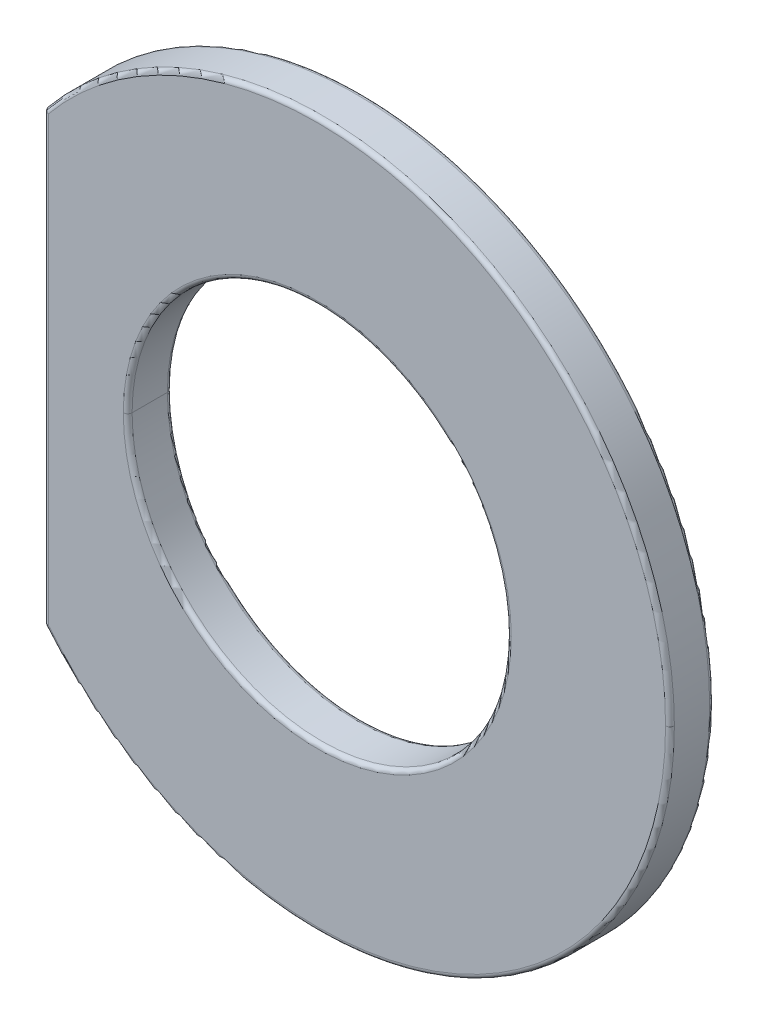
ISO-10303-21;
HEADER;
FILE_DESCRIPTION(('STEP AP214'),'2;1');
FILE_NAME('part.step','',(''),(''),'','','');
FILE_SCHEMA(('AUTOMOTIVE_DESIGN { 1 0 10303 214 1 1 1 1 }'));
ENDSEC;
DATA;
#1=APPLICATION_CONTEXT('core data for automotive mechanical design processes');
#2=APPLICATION_PROTOCOL_DEFINITION('international standard','automotive_design',2000,#1);
#3=PRODUCT_CONTEXT('',#1,'mechanical');
#4=PRODUCT('Part','Part','',(#3));
#5=PRODUCT_RELATED_PRODUCT_CATEGORY('part','',(#4));
#6=PRODUCT_DEFINITION_FORMATION('','',#4);
#7=PRODUCT_DEFINITION_CONTEXT('part definition',#1,'design');
#8=PRODUCT_DEFINITION('design','',#6,#7);
#9=PRODUCT_DEFINITION_SHAPE('','',#8);
#10=(LENGTH_UNIT() NAMED_UNIT(*) SI_UNIT(.MILLI.,.METRE.));
#11=(NAMED_UNIT(*) PLANE_ANGLE_UNIT() SI_UNIT($,.RADIAN.));
#12=(NAMED_UNIT(*) SI_UNIT($,.STERADIAN.) SOLID_ANGLE_UNIT());
#13=UNCERTAINTY_MEASURE_WITH_UNIT(LENGTH_MEASURE(1.E-05),#10,'distance_accuracy_value','');
#14=(GEOMETRIC_REPRESENTATION_CONTEXT(3) GLOBAL_UNCERTAINTY_ASSIGNED_CONTEXT((#13)) GLOBAL_UNIT_ASSIGNED_CONTEXT((#10,
#11,#12)) REPRESENTATION_CONTEXT('',''));
#15=CARTESIAN_POINT('',(0.,0.,0.));
#16=DIRECTION('',(0.,0.,1.));
#17=DIRECTION('',(1.,0.,0.));
#18=AXIS2_PLACEMENT_3D('',#15,#16,#17);
#19=CARTESIAN_POINT('',(0.,0.,-0.2));
#20=DIRECTION('',(0.,0.,1.));
#21=DIRECTION('',(1.,0.,0.));
#22=AXIS2_PLACEMENT_3D('',#19,#20,#21);
#23=TOROIDAL_SURFACE('',#22,3.95,0.05);
#24=CARTESIAN_POINT('',(3.95,0.,-0.2));
#25=DIRECTION('',(0.,-1.,0.));
#26=DIRECTION('',(0.,0.,-1.));
#27=AXIS2_PLACEMENT_3D('',#24,#25,#26);
#28=CIRCLE('',#27,0.05);
#29=CARTESIAN_POINT('',(3.95,0.,-0.25));
#30=VERTEX_POINT('',#29);
#31=CARTESIAN_POINT('',(4.,0.,-0.2));
#32=VERTEX_POINT('',#31);
#33=EDGE_CURVE('E151',#30,#32,#28,.T.);
#34=ORIENTED_EDGE('',*,*,#33,.F.);
#35=CARTESIAN_POINT('',(0.,0.,-0.25));
#36=DIRECTION('',(0.,0.,-1.));
#37=DIRECTION('',(1.,0.,0.));
#38=AXIS2_PLACEMENT_3D('',#35,#36,#37);
#39=CIRCLE('',#38,3.95);
#40=CARTESIAN_POINT('',(-3.05,2.50998007960223,-0.25));
#41=VERTEX_POINT('',#40);
#42=EDGE_CURVE('E139',#41,#30,#39,.T.);
#43=ORIENTED_EDGE('',*,*,#42,.F.);
#44=CARTESIAN_POINT('',(-3.05,2.50998007960223,-0.2));
#45=DIRECTION('',(0.635437994836009,0.772151898734175,0.));
#46=DIRECTION('',(0.772151898734175,-0.635437994836009,0.));
#47=AXIS2_PLACEMENT_3D('',#44,#45,#46);
#48=CIRCLE('',#47,0.05);
#49=CARTESIAN_POINT('',(-3.08860759493671,2.54175197934403,-0.2));
#50=VERTEX_POINT('',#49);
#51=EDGE_CURVE('E10',#41,#50,#48,.T.);
#52=ORIENTED_EDGE('',*,*,#51,.T.);
#53=CARTESIAN_POINT('',(0.,0.,-0.2));
#54=DIRECTION('',(0.,0.,1.));
#55=DIRECTION('',(1.,0.,0.));
#56=AXIS2_PLACEMENT_3D('',#53,#54,#55);
#57=CIRCLE('',#56,4.);
#58=EDGE_CURVE('E153',#32,#50,#57,.T.);
#59=ORIENTED_EDGE('',*,*,#58,.F.);
#60=EDGE_LOOP('',(#34,#43,#52,#59));
#61=FACE_BOUND('',#60,.T.);
#62=ADVANCED_FACE('F15',(#61),#23,.T.);
#63=CARTESIAN_POINT('',(-3.05,2.50998007960223,-0.2));
#64=DIRECTION('',(0.,1.,0.));
#65=DIRECTION('',(1.,0.,0.));
#66=AXIS2_PLACEMENT_3D('',#63,#64,#65);
#67=SPHERICAL_SURFACE('',#66,0.05);
#68=CARTESIAN_POINT('',(-3.05,2.50998007960223,-0.2));
#69=DIRECTION('',(0.,1.,0.));
#70=DIRECTION('',(-1.,0.,0.));
#71=AXIS2_PLACEMENT_3D('',#68,#69,#70);
#72=CIRCLE('',#71,0.05);
#73=CARTESIAN_POINT('',(-3.1,2.50998007960223,-0.2));
#74=VERTEX_POINT('',#73);
#75=EDGE_CURVE('E18',#41,#74,#72,.T.);
#76=ORIENTED_EDGE('',*,*,#75,.T.);
#77=CARTESIAN_POINT('',(-3.05,2.50998007960223,-0.2));
#78=DIRECTION('',(0.,0.,-1.));
#79=DIRECTION('',(-1.,0.,0.));
#80=AXIS2_PLACEMENT_3D('',#77,#78,#79);
#81=CIRCLE('',#80,0.05);
#82=EDGE_CURVE('E296',#74,#50,#81,.T.);
#83=ORIENTED_EDGE('',*,*,#82,.T.);
#84=ORIENTED_EDGE('',*,*,#51,.F.);
#85=EDGE_LOOP('',(#76,#83,#84));
#86=FACE_BOUND('',#85,.T.);
#87=ADVANCED_FACE('F311',(#86),#67,.T.);
#88=CARTESIAN_POINT('',(-3.05,-2.50998007960223,-0.2));
#89=DIRECTION('',(0.,1.,0.));
#90=DIRECTION('',(1.,0.,0.));
#91=AXIS2_PLACEMENT_3D('',#88,#89,#90);
#92=SPHERICAL_SURFACE('',#91,0.05);
#93=CARTESIAN_POINT('',(-3.05,-2.50998007960223,-0.2));
#94=DIRECTION('',(0.,0.,-1.));
#95=DIRECTION('',(-1.,0.,0.));
#96=AXIS2_PLACEMENT_3D('',#93,#94,#95);
#97=CIRCLE('',#96,0.05);
#98=CARTESIAN_POINT('',(-3.08860759493671,-2.54175197934403,-0.2));
#99=VERTEX_POINT('',#98);
#100=CARTESIAN_POINT('',(-3.1,-2.50998007960223,-0.2));
#101=VERTEX_POINT('',#100);
#102=EDGE_CURVE('E292',#99,#101,#97,.T.);
#103=ORIENTED_EDGE('',*,*,#102,.T.);
#104=CARTESIAN_POINT('',(-3.05,-2.50998007960223,-0.2));
#105=DIRECTION('',(0.,-1.,0.));
#106=DIRECTION('',(0.,0.,-1.));
#107=AXIS2_PLACEMENT_3D('',#104,#105,#106);
#108=CIRCLE('',#107,0.05);
#109=CARTESIAN_POINT('',(-3.05,-2.50998007960223,-0.25));
#110=VERTEX_POINT('',#109);
#111=EDGE_CURVE('E299',#101,#110,#108,.T.);
#112=ORIENTED_EDGE('',*,*,#111,.T.);
#113=CARTESIAN_POINT('',(-3.05,-2.50998007960223,-0.2));
#114=DIRECTION('',(0.635437994836009,-0.772151898734175,0.));
#115=DIRECTION('',(-0.772151898734175,-0.635437994836009,0.));
#116=AXIS2_PLACEMENT_3D('',#113,#114,#115);
#117=CIRCLE('',#116,0.05);
#118=EDGE_CURVE('E163',#99,#110,#117,.T.);
#119=ORIENTED_EDGE('',*,*,#118,.F.);
#120=EDGE_LOOP('',(#103,#112,#119));
#121=FACE_BOUND('',#120,.T.);
#122=ADVANCED_FACE('F322',(#121),#92,.T.);
#123=CARTESIAN_POINT('',(-3.05,2.52784493195291,-0.2));
#124=DIRECTION('',(0.,-1.,0.));
#125=DIRECTION('',(0.,0.,-1.));
#126=AXIS2_PLACEMENT_3D('',#123,#124,#125);
#127=CYLINDRICAL_SURFACE('',#126,0.05);
#128=ORIENTED_EDGE('',*,*,#111,.F.);
#129=DIRECTION('',(0.,-1.,0.));
#130=VECTOR('',#129,1.);
#131=CARTESIAN_POINT('',(-3.1,2.52784493195291,-0.2));
#132=LINE('',#131,#130);
#133=EDGE_CURVE('E259',#74,#101,#132,.T.);
#134=ORIENTED_EDGE('',*,*,#133,.F.);
#135=ORIENTED_EDGE('',*,*,#75,.F.);
#136=DIRECTION('',(0.,1.,0.));
#137=VECTOR('',#136,1.);
#138=CARTESIAN_POINT('',(-3.05,0.,-0.25));
#139=LINE('',#138,#137);
#140=EDGE_CURVE('E145',#110,#41,#139,.T.);
#141=ORIENTED_EDGE('',*,*,#140,.F.);
#142=EDGE_LOOP('',(#128,#134,#135,#141));
#143=FACE_BOUND('',#142,.T.);
#144=ADVANCED_FACE('F321',(#143),#127,.T.);
#145=CARTESIAN_POINT('',(-3.05,2.50998007960223,0.25));
#146=DIRECTION('',(0.,0.,-1.));
#147=DIRECTION('',(-1.,0.,0.));
#148=AXIS2_PLACEMENT_3D('',#145,#146,#147);
#149=CYLINDRICAL_SURFACE('',#148,0.05);
#150=CARTESIAN_POINT('',(-3.05,2.50998007960223,0.2));
#151=DIRECTION('',(0.,0.,-1.));
#152=DIRECTION('',(1.,0.,0.));
#153=AXIS2_PLACEMENT_3D('',#150,#151,#152);
#154=CIRCLE('',#153,0.05);
#155=CARTESIAN_POINT('',(-3.1,2.50998007960223,0.2));
#156=VERTEX_POINT('',#155);
#157=CARTESIAN_POINT('',(-3.08860759493671,2.54175197934403,0.2));
#158=VERTEX_POINT('',#157);
#159=EDGE_CURVE('E37',#156,#158,#154,.T.);
#160=ORIENTED_EDGE('',*,*,#159,.T.);
#161=DIRECTION('',(0.,0.,1.));
#162=VECTOR('',#161,1.);
#163=CARTESIAN_POINT('',(-3.08860759493671,2.54175197934403,0.25));
#164=LINE('',#163,#162);
#165=EDGE_CURVE('E253',#50,#158,#164,.T.);
#166=ORIENTED_EDGE('',*,*,#165,.F.);
#167=ORIENTED_EDGE('',*,*,#82,.F.);
#168=DIRECTION('',(0.,0.,-1.));
#169=VECTOR('',#168,1.);
#170=CARTESIAN_POINT('',(-3.1,2.50998007960223,0.25));
#171=LINE('',#170,#169);
#172=EDGE_CURVE('E270',#156,#74,#171,.T.);
#173=ORIENTED_EDGE('',*,*,#172,.F.);
#174=EDGE_LOOP('',(#160,#166,#167,#173));
#175=FACE_BOUND('',#174,.T.);
#176=ADVANCED_FACE('F317',(#175),#149,.T.);
#177=CARTESIAN_POINT('',(-3.05,-2.50998007960223,0.25));
#178=DIRECTION('',(0.,0.,-1.));
#179=DIRECTION('',(-1.,0.,0.));
#180=AXIS2_PLACEMENT_3D('',#177,#178,#179);
#181=CYLINDRICAL_SURFACE('',#180,0.05);
#182=CARTESIAN_POINT('',(-3.05,-2.50998007960223,0.2));
#183=DIRECTION('',(0.,0.,-1.));
#184=DIRECTION('',(1.,0.,0.));
#185=AXIS2_PLACEMENT_3D('',#182,#183,#184);
#186=CIRCLE('',#185,0.05);
#187=CARTESIAN_POINT('',(-3.08860759493671,-2.54175197934403,0.2));
#188=VERTEX_POINT('',#187);
#189=CARTESIAN_POINT('',(-3.1,-2.50998007960223,0.2));
#190=VERTEX_POINT('',#189);
#191=EDGE_CURVE('E48',#188,#190,#186,.T.);
#192=ORIENTED_EDGE('',*,*,#191,.T.);
#193=DIRECTION('',(0.,0.,1.));
#194=VECTOR('',#193,1.);
#195=CARTESIAN_POINT('',(-3.1,-2.50998007960223,0.25));
#196=LINE('',#195,#194);
#197=EDGE_CURVE('E271',#101,#190,#196,.T.);
#198=ORIENTED_EDGE('',*,*,#197,.F.);
#199=ORIENTED_EDGE('',*,*,#102,.F.);
#200=DIRECTION('',(0.,0.,-1.));
#201=VECTOR('',#200,1.);
#202=CARTESIAN_POINT('',(-3.08860759493671,-2.54175197934403,0.25));
#203=LINE('',#202,#201);
#204=EDGE_CURVE('E254',#188,#99,#203,.T.);
#205=ORIENTED_EDGE('',*,*,#204,.F.);
#206=EDGE_LOOP('',(#192,#198,#199,#205));
#207=FACE_BOUND('',#206,.T.);
#208=ADVANCED_FACE('F323',(#207),#181,.T.);
#209=CARTESIAN_POINT('',(-3.05,2.50998007960223,0.2));
#210=DIRECTION('',(0.,1.,0.));
#211=DIRECTION('',(1.,0.,0.));
#212=AXIS2_PLACEMENT_3D('',#209,#210,#211);
#213=SPHERICAL_SURFACE('',#212,0.05);
#214=CARTESIAN_POINT('',(-3.05,2.50998007960223,0.2));
#215=DIRECTION('',(0.,1.,0.));
#216=DIRECTION('',(0.,0.,1.));
#217=AXIS2_PLACEMENT_3D('',#214,#215,#216);
#218=CIRCLE('',#217,0.05);
#219=CARTESIAN_POINT('',(-3.05,2.50998007960223,0.25));
#220=VERTEX_POINT('',#219);
#221=EDGE_CURVE('E201',#156,#220,#218,.T.);
#222=ORIENTED_EDGE('',*,*,#221,.T.);
#223=CARTESIAN_POINT('',(-3.05,2.50998007960223,0.2));
#224=DIRECTION('',(-0.635437994836004,-0.77215189873418,0.));
#225=DIRECTION('',(0.77215189873418,-0.635437994836004,0.));
#226=AXIS2_PLACEMENT_3D('',#223,#224,#225);
#227=CIRCLE('',#226,0.05);
#228=EDGE_CURVE('E202',#220,#158,#227,.T.);
#229=ORIENTED_EDGE('',*,*,#228,.T.);
#230=ORIENTED_EDGE('',*,*,#159,.F.);
#231=EDGE_LOOP('',(#222,#229,#230));
#232=FACE_BOUND('',#231,.T.);
#233=ADVANCED_FACE('F325',(#232),#213,.T.);
#234=CARTESIAN_POINT('',(-3.05,-2.50998007960223,0.2));
#235=DIRECTION('',(0.,1.,0.));
#236=DIRECTION('',(1.,0.,0.));
#237=AXIS2_PLACEMENT_3D('',#234,#235,#236);
#238=SPHERICAL_SURFACE('',#237,0.05);
#239=CARTESIAN_POINT('',(-3.05,-2.50998007960223,0.2));
#240=DIRECTION('',(-0.635437994836009,0.772151898734175,0.));
#241=DIRECTION('',(-0.772151898734175,-0.635437994836009,0.));
#242=AXIS2_PLACEMENT_3D('',#239,#240,#241);
#243=CIRCLE('',#242,0.05);
#244=CARTESIAN_POINT('',(-3.05,-2.50998007960223,0.25));
#245=VERTEX_POINT('',#244);
#246=EDGE_CURVE('E197',#188,#245,#243,.T.);
#247=ORIENTED_EDGE('',*,*,#246,.T.);
#248=CARTESIAN_POINT('',(-3.05,-2.50998007960223,0.2));
#249=DIRECTION('',(0.,-1.,0.));
#250=DIRECTION('',(0.,0.,-1.));
#251=AXIS2_PLACEMENT_3D('',#248,#249,#250);
#252=CIRCLE('',#251,0.05);
#253=EDGE_CURVE('E198',#245,#190,#252,.T.);
#254=ORIENTED_EDGE('',*,*,#253,.T.);
#255=ORIENTED_EDGE('',*,*,#191,.F.);
#256=EDGE_LOOP('',(#247,#254,#255));
#257=FACE_BOUND('',#256,.T.);
#258=ADVANCED_FACE('F332',(#257),#238,.T.);
#259=CARTESIAN_POINT('',(-3.05,0.,0.2));
#260=DIRECTION('',(0.,1.,0.));
#261=DIRECTION('',(0.,0.,1.));
#262=AXIS2_PLACEMENT_3D('',#259,#260,#261);
#263=CYLINDRICAL_SURFACE('',#262,0.05);
#264=ORIENTED_EDGE('',*,*,#253,.F.);
#265=DIRECTION('',(0.,-1.,0.));
#266=VECTOR('',#265,1.);
#267=CARTESIAN_POINT('',(-3.05,-2.52784493195291,0.25));
#268=LINE('',#267,#266);
#269=EDGE_CURVE('E247',#220,#245,#268,.T.);
#270=ORIENTED_EDGE('',*,*,#269,.F.);
#271=ORIENTED_EDGE('',*,*,#221,.F.);
#272=DIRECTION('',(0.,1.,0.));
#273=VECTOR('',#272,1.);
#274=CARTESIAN_POINT('',(-3.1,2.52784493195291,0.2));
#275=LINE('',#274,#273);
#276=EDGE_CURVE('E266',#190,#156,#275,.T.);
#277=ORIENTED_EDGE('',*,*,#276,.F.);
#278=EDGE_LOOP('',(#264,#270,#271,#277));
#279=FACE_BOUND('',#278,.T.);
#280=ADVANCED_FACE('F381',(#279),#263,.T.);
#281=CARTESIAN_POINT('',(0.,0.,0.2));
#282=DIRECTION('',(0.,0.,1.));
#283=DIRECTION('',(1.,0.,0.));
#284=AXIS2_PLACEMENT_3D('',#281,#282,#283);
#285=TOROIDAL_SURFACE('',#284,3.95,0.05);
#286=CARTESIAN_POINT('',(3.95,0.,0.2));
#287=DIRECTION('',(0.,-1.,0.));
#288=DIRECTION('',(0.,0.,-1.));
#289=AXIS2_PLACEMENT_3D('',#286,#287,#288);
#290=CIRCLE('',#289,0.05);
#291=CARTESIAN_POINT('',(4.,0.,0.2));
#292=VERTEX_POINT('',#291);
#293=CARTESIAN_POINT('',(3.95,0.,0.25));
#294=VERTEX_POINT('',#293);
#295=EDGE_CURVE('E175',#292,#294,#290,.T.);
#296=ORIENTED_EDGE('',*,*,#295,.F.);
#297=CARTESIAN_POINT('',(0.,0.,0.2));
#298=DIRECTION('',(0.,0.,-1.));
#299=DIRECTION('',(1.,0.,0.));
#300=AXIS2_PLACEMENT_3D('',#297,#298,#299);
#301=CIRCLE('',#300,4.);
#302=EDGE_CURVE('E257',#158,#292,#301,.T.);
#303=ORIENTED_EDGE('',*,*,#302,.F.);
#304=ORIENTED_EDGE('',*,*,#228,.F.);
#305=CARTESIAN_POINT('',(0.,0.,0.25));
#306=DIRECTION('',(0.,0.,1.));
#307=DIRECTION('',(1.,0.,0.));
#308=AXIS2_PLACEMENT_3D('',#305,#306,#307);
#309=CIRCLE('',#308,3.95);
#310=EDGE_CURVE('E243',#294,#220,#309,.T.);
#311=ORIENTED_EDGE('',*,*,#310,.F.);
#312=EDGE_LOOP('',(#296,#303,#304,#311));
#313=FACE_BOUND('',#312,.T.);
#314=ADVANCED_FACE('F391',(#313),#285,.T.);
#315=CARTESIAN_POINT('',(0.,0.,0.2));
#316=DIRECTION('',(0.,0.,1.));
#317=DIRECTION('',(1.,0.,0.));
#318=AXIS2_PLACEMENT_3D('',#315,#316,#317);
#319=TOROIDAL_SURFACE('',#318,2.2,0.05);
#320=CARTESIAN_POINT('',(-2.2,0.,0.2));
#321=DIRECTION('',(0.,1.,0.));
#322=DIRECTION('',(-1.,0.,0.));
#323=AXIS2_PLACEMENT_3D('',#320,#321,#322);
#324=CIRCLE('',#323,0.05);
#325=CARTESIAN_POINT('',(-2.2,0.,0.25));
#326=VERTEX_POINT('',#325);
#327=CARTESIAN_POINT('',(-2.15,0.,0.2));
#328=VERTEX_POINT('',#327);
#329=EDGE_CURVE('E183',#326,#328,#324,.T.);
#330=ORIENTED_EDGE('',*,*,#329,.F.);
#331=CARTESIAN_POINT('',(0.,0.,0.25));
#332=DIRECTION('',(0.,0.,-1.));
#333=DIRECTION('',(1.,0.,0.));
#334=AXIS2_PLACEMENT_3D('',#331,#332,#333);
#335=CIRCLE('',#334,2.2);
#336=CARTESIAN_POINT('',(2.2,0.,0.25));
#337=VERTEX_POINT('',#336);
#338=EDGE_CURVE('E174',#337,#326,#335,.T.);
#339=ORIENTED_EDGE('',*,*,#338,.F.);
#340=CARTESIAN_POINT('',(2.2,0.,0.2));
#341=DIRECTION('',(0.,-1.,0.));
#342=DIRECTION('',(0.,0.,-1.));
#343=AXIS2_PLACEMENT_3D('',#340,#341,#342);
#344=CIRCLE('',#343,0.05);
#345=CARTESIAN_POINT('',(2.15,0.,0.2));
#346=VERTEX_POINT('',#345);
#347=EDGE_CURVE('E206',#337,#346,#344,.T.);
#348=ORIENTED_EDGE('',*,*,#347,.T.);
#349=CARTESIAN_POINT('',(0.,0.,0.2));
#350=DIRECTION('',(0.,0.,1.));
#351=DIRECTION('',(1.,0.,0.));
#352=AXIS2_PLACEMENT_3D('',#349,#350,#351);
#353=CIRCLE('',#352,2.15);
#354=EDGE_CURVE('E232',#328,#346,#353,.T.);
#355=ORIENTED_EDGE('',*,*,#354,.F.);
#356=EDGE_LOOP('',(#330,#339,#348,#355));
#357=FACE_BOUND('',#356,.T.);
#358=ADVANCED_FACE('F402',(#357),#319,.T.);
#359=CARTESIAN_POINT('',(0.,0.,-0.2));
#360=DIRECTION('',(0.,0.,1.));
#361=DIRECTION('',(1.,0.,0.));
#362=AXIS2_PLACEMENT_3D('',#359,#360,#361);
#363=TOROIDAL_SURFACE('',#362,2.2,0.05);
#364=CARTESIAN_POINT('',(-2.2,0.,-0.2));
#365=DIRECTION('',(0.,1.,0.));
#366=DIRECTION('',(-1.,0.,0.));
#367=AXIS2_PLACEMENT_3D('',#364,#365,#366);
#368=CIRCLE('',#367,0.05);
#369=CARTESIAN_POINT('',(-2.15,0.,-0.2));
#370=VERTEX_POINT('',#369);
#371=CARTESIAN_POINT('',(-2.2,0.,-0.25));
#372=VERTEX_POINT('',#371);
#373=EDGE_CURVE('E220',#370,#372,#368,.T.);
#374=ORIENTED_EDGE('',*,*,#373,.F.);
#375=CARTESIAN_POINT('',(0.,0.,-0.2));
#376=DIRECTION('',(0.,0.,-1.));
#377=DIRECTION('',(1.,0.,0.));
#378=AXIS2_PLACEMENT_3D('',#375,#376,#377);
#379=CIRCLE('',#378,2.15);
#380=CARTESIAN_POINT('',(2.15,0.,-0.2));
#381=VERTEX_POINT('',#380);
#382=EDGE_CURVE('E172',#381,#370,#379,.T.);
#383=ORIENTED_EDGE('',*,*,#382,.F.);
#384=CARTESIAN_POINT('',(2.2,0.,-0.2));
#385=DIRECTION('',(0.,-1.,0.));
#386=DIRECTION('',(0.,0.,-1.));
#387=AXIS2_PLACEMENT_3D('',#384,#385,#386);
#388=CIRCLE('',#387,0.05);
#389=CARTESIAN_POINT('',(2.2,0.,-0.25));
#390=VERTEX_POINT('',#389);
#391=EDGE_CURVE('E228',#381,#390,#388,.T.);
#392=ORIENTED_EDGE('',*,*,#391,.T.);
#393=CARTESIAN_POINT('',(0.,0.,-0.25));
#394=DIRECTION('',(0.,0.,1.));
#395=DIRECTION('',(1.,0.,0.));
#396=AXIS2_PLACEMENT_3D('',#393,#394,#395);
#397=CIRCLE('',#396,2.2);
#398=EDGE_CURVE('E148',#372,#390,#397,.T.);
#399=ORIENTED_EDGE('',*,*,#398,.F.);
#400=EDGE_LOOP('',(#374,#383,#392,#399));
#401=FACE_BOUND('',#400,.T.);
#402=ADVANCED_FACE('F413',(#401),#363,.T.);
#403=CARTESIAN_POINT('',(0.,0.,0.25));
#404=DIRECTION('',(0.,0.,-1.));
#405=DIRECTION('',(-1.,0.,0.));
#406=AXIS2_PLACEMENT_3D('',#403,#404,#405);
#407=CYLINDRICAL_SURFACE('',#406,2.15);
#408=DIRECTION('',(0.,0.,-1.));
#409=VECTOR('',#408,1.);
#410=CARTESIAN_POINT('',(2.15,0.,0.25));
#411=LINE('',#410,#409);
#412=EDGE_CURVE('E236',#346,#381,#411,.T.);
#413=ORIENTED_EDGE('',*,*,#412,.F.);
#414=CARTESIAN_POINT('',(0.,0.,0.2));
#415=DIRECTION('',(0.,0.,1.));
#416=DIRECTION('',(1.,0.,0.));
#417=AXIS2_PLACEMENT_3D('',#414,#415,#416);
#418=CIRCLE('',#417,2.15);
#419=EDGE_CURVE('E187',#346,#328,#418,.T.);
#420=ORIENTED_EDGE('',*,*,#419,.T.);
#421=DIRECTION('',(0.,0.,-1.));
#422=VECTOR('',#421,1.);
#423=CARTESIAN_POINT('',(-2.15,0.,0.25));
#424=LINE('',#423,#422);
#425=EDGE_CURVE('E240',#328,#370,#424,.T.);
#426=ORIENTED_EDGE('',*,*,#425,.T.);
#427=CARTESIAN_POINT('',(0.,0.,-0.2));
#428=DIRECTION('',(0.,0.,-1.));
#429=DIRECTION('',(1.,0.,0.));
#430=AXIS2_PLACEMENT_3D('',#427,#428,#429);
#431=CIRCLE('',#430,2.15);
#432=EDGE_CURVE('E210',#370,#381,#431,.T.);
#433=ORIENTED_EDGE('',*,*,#432,.T.);
#434=EDGE_LOOP('',(#413,#420,#426,#433));
#435=FACE_BOUND('',#434,.T.);
#436=ADVANCED_FACE('F424',(#435),#407,.F.);
#437=CARTESIAN_POINT('',(-3.1,2.52784493195291,0.25));
#438=DIRECTION('',(1.,0.,0.));
#439=DIRECTION('',(0.,1.,0.));
#440=AXIS2_PLACEMENT_3D('',#437,#438,#439);
#441=PLANE('',#440);
#442=ORIENTED_EDGE('',*,*,#133,.T.);
#443=ORIENTED_EDGE('',*,*,#197,.T.);
#444=ORIENTED_EDGE('',*,*,#276,.T.);
#445=ORIENTED_EDGE('',*,*,#172,.T.);
#446=EDGE_LOOP('',(#442,#443,#444,#445));
#447=FACE_BOUND('',#446,.T.);
#448=ADVANCED_FACE('F319',(#447),#441,.F.);
#449=CARTESIAN_POINT('',(0.,0.,0.25));
#450=DIRECTION('',(0.,0.,-1.));
#451=DIRECTION('',(-1.,0.,0.));
#452=AXIS2_PLACEMENT_3D('',#449,#450,#451);
#453=CYLINDRICAL_SURFACE('',#452,4.);
#454=ORIENTED_EDGE('',*,*,#204,.T.);
#455=CARTESIAN_POINT('',(0.,0.,-0.2));
#456=DIRECTION('',(0.,0.,1.));
#457=DIRECTION('',(1.,0.,0.));
#458=AXIS2_PLACEMENT_3D('',#455,#456,#457);
#459=CIRCLE('',#458,4.);
#460=EDGE_CURVE('E158',#99,#32,#459,.T.);
#461=ORIENTED_EDGE('',*,*,#460,.T.);
#462=ORIENTED_EDGE('',*,*,#58,.T.);
#463=ORIENTED_EDGE('',*,*,#165,.T.);
#464=ORIENTED_EDGE('',*,*,#302,.T.);
#465=CARTESIAN_POINT('',(0.,0.,0.2));
#466=DIRECTION('',(0.,0.,-1.));
#467=DIRECTION('',(1.,0.,0.));
#468=AXIS2_PLACEMENT_3D('',#465,#466,#467);
#469=CIRCLE('',#468,4.);
#470=EDGE_CURVE('E179',#292,#188,#469,.T.);
#471=ORIENTED_EDGE('',*,*,#470,.T.);
#472=EDGE_LOOP('',(#454,#461,#462,#463,#464,#471));
#473=FACE_BOUND('',#472,.T.);
#474=ADVANCED_FACE('F445',(#473),#453,.T.);
#475=CARTESIAN_POINT('',(0.,0.,-0.25));
#476=DIRECTION('',(0.,0.,1.));
#477=DIRECTION('',(1.,0.,0.));
#478=AXIS2_PLACEMENT_3D('',#475,#476,#477);
#479=PLANE('',#478);
#480=CARTESIAN_POINT('',(0.,0.,-0.25));
#481=DIRECTION('',(0.,0.,1.));
#482=DIRECTION('',(1.,0.,0.));
#483=AXIS2_PLACEMENT_3D('',#480,#481,#482);
#484=CIRCLE('',#483,2.2);
#485=EDGE_CURVE('E224',#390,#372,#484,.T.);
#486=ORIENTED_EDGE('',*,*,#485,.T.);
#487=ORIENTED_EDGE('',*,*,#398,.T.);
#488=EDGE_LOOP('',(#486,#487));
#489=FACE_BOUND('',#488,.T.);
#490=ORIENTED_EDGE('',*,*,#140,.T.);
#491=ORIENTED_EDGE('',*,*,#42,.T.);
#492=CARTESIAN_POINT('',(0.,0.,-0.25));
#493=DIRECTION('',(0.,0.,-1.));
#494=DIRECTION('',(1.,0.,0.));
#495=AXIS2_PLACEMENT_3D('',#492,#493,#494);
#496=CIRCLE('',#495,3.95);
#497=EDGE_CURVE('E143',#30,#110,#496,.T.);
#498=ORIENTED_EDGE('',*,*,#497,.T.);
#499=EDGE_LOOP('',(#490,#491,#498));
#500=FACE_BOUND('',#499,.T.);
#501=ADVANCED_FACE('F141',(#489,#500),#479,.F.);
#502=CARTESIAN_POINT('',(0.,0.,0.25));
#503=DIRECTION('',(0.,0.,1.));
#504=DIRECTION('',(1.,0.,0.));
#505=AXIS2_PLACEMENT_3D('',#502,#503,#504);
#506=PLANE('',#505);
#507=ORIENTED_EDGE('',*,*,#338,.T.);
#508=CARTESIAN_POINT('',(0.,0.,0.25));
#509=DIRECTION('',(0.,0.,-1.));
#510=DIRECTION('',(1.,0.,0.));
#511=AXIS2_PLACEMENT_3D('',#508,#509,#510);
#512=CIRCLE('',#511,2.2);
#513=EDGE_CURVE('E188',#326,#337,#512,.T.);
#514=ORIENTED_EDGE('',*,*,#513,.T.);
#515=EDGE_LOOP('',(#507,#514));
#516=FACE_BOUND('',#515,.T.);
#517=CARTESIAN_POINT('',(0.,0.,0.25));
#518=DIRECTION('',(0.,0.,1.));
#519=DIRECTION('',(1.,0.,0.));
#520=AXIS2_PLACEMENT_3D('',#517,#518,#519);
#521=CIRCLE('',#520,3.95);
#522=EDGE_CURVE('E178',#245,#294,#521,.T.);
#523=ORIENTED_EDGE('',*,*,#522,.T.);
#524=ORIENTED_EDGE('',*,*,#310,.T.);
#525=ORIENTED_EDGE('',*,*,#269,.T.);
#526=EDGE_LOOP('',(#523,#524,#525));
#527=FACE_BOUND('',#526,.T.);
#528=ADVANCED_FACE('F465',(#516,#527),#506,.T.);
#529=CARTESIAN_POINT('',(0.,0.,0.25));
#530=DIRECTION('',(0.,0.,-1.));
#531=DIRECTION('',(-1.,0.,0.));
#532=AXIS2_PLACEMENT_3D('',#529,#530,#531);
#533=CYLINDRICAL_SURFACE('',#532,2.15);
#534=ORIENTED_EDGE('',*,*,#354,.T.);
#535=ORIENTED_EDGE('',*,*,#412,.T.);
#536=ORIENTED_EDGE('',*,*,#382,.T.);
#537=ORIENTED_EDGE('',*,*,#425,.F.);
#538=EDGE_LOOP('',(#534,#535,#536,#537));
#539=FACE_BOUND('',#538,.T.);
#540=ADVANCED_FACE('F476',(#539),#533,.F.);
#541=CARTESIAN_POINT('',(0.,0.,-0.2));
#542=DIRECTION('',(0.,0.,1.));
#543=DIRECTION('',(1.,0.,0.));
#544=AXIS2_PLACEMENT_3D('',#541,#542,#543);
#545=TOROIDAL_SURFACE('',#544,2.2,0.05);
#546=ORIENTED_EDGE('',*,*,#432,.F.);
#547=ORIENTED_EDGE('',*,*,#373,.T.);
#548=ORIENTED_EDGE('',*,*,#485,.F.);
#549=ORIENTED_EDGE('',*,*,#391,.F.);
#550=EDGE_LOOP('',(#546,#547,#548,#549));
#551=FACE_BOUND('',#550,.T.);
#552=ADVANCED_FACE('F487',(#551),#545,.T.);
#553=CARTESIAN_POINT('',(0.,0.,0.2));
#554=DIRECTION('',(0.,0.,1.));
#555=DIRECTION('',(1.,0.,0.));
#556=AXIS2_PLACEMENT_3D('',#553,#554,#555);
#557=TOROIDAL_SURFACE('',#556,2.2,0.05);
#558=ORIENTED_EDGE('',*,*,#513,.F.);
#559=ORIENTED_EDGE('',*,*,#329,.T.);
#560=ORIENTED_EDGE('',*,*,#419,.F.);
#561=ORIENTED_EDGE('',*,*,#347,.F.);
#562=EDGE_LOOP('',(#558,#559,#560,#561));
#563=FACE_BOUND('',#562,.T.);
#564=ADVANCED_FACE('F498',(#563),#557,.T.);
#565=CARTESIAN_POINT('',(0.,0.,0.2));
#566=DIRECTION('',(0.,0.,1.));
#567=DIRECTION('',(1.,0.,0.));
#568=AXIS2_PLACEMENT_3D('',#565,#566,#567);
#569=TOROIDAL_SURFACE('',#568,3.95,0.05);
#570=ORIENTED_EDGE('',*,*,#470,.F.);
#571=ORIENTED_EDGE('',*,*,#295,.T.);
#572=ORIENTED_EDGE('',*,*,#522,.F.);
#573=ORIENTED_EDGE('',*,*,#246,.F.);
#574=EDGE_LOOP('',(#570,#571,#572,#573));
#575=FACE_BOUND('',#574,.T.);
#576=ADVANCED_FACE('F509',(#575),#569,.T.);
#577=CARTESIAN_POINT('',(0.,0.,-0.2));
#578=DIRECTION('',(0.,0.,1.));
#579=DIRECTION('',(1.,0.,0.));
#580=AXIS2_PLACEMENT_3D('',#577,#578,#579);
#581=TOROIDAL_SURFACE('',#580,3.95,0.05);
#582=ORIENTED_EDGE('',*,*,#497,.F.);
#583=ORIENTED_EDGE('',*,*,#33,.T.);
#584=ORIENTED_EDGE('',*,*,#460,.F.);
#585=ORIENTED_EDGE('',*,*,#118,.T.);
#586=EDGE_LOOP('',(#582,#583,#584,#585));
#587=FACE_BOUND('',#586,.T.);
#588=ADVANCED_FACE('F161',(#587),#581,.T.);
#589=CLOSED_SHELL('',(#62,#87,#122,#144,#176,#208,#233,#258,#280,#314,#358,#402,#436,#448,#474,
#501,#528,#540,#552,#564,#576,#588));
#590=MANIFOLD_SOLID_BREP('B1',#589);
#591=ADVANCED_BREP_SHAPE_REPRESENTATION('',(#18,#590),#14);
#592=SHAPE_DEFINITION_REPRESENTATION(#9,#591);
ENDSEC;
END-ISO-10303-21;
